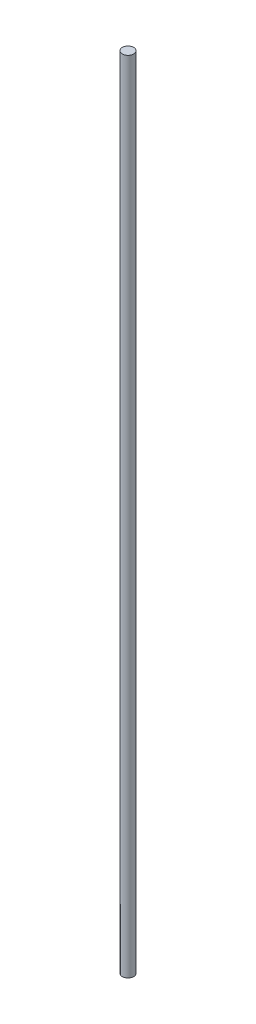
ISO-10303-21;
HEADER;
FILE_DESCRIPTION(('STEP AP214'),'2;1');
FILE_NAME('part.step','',(''),(''),'','','');
FILE_SCHEMA(('AUTOMOTIVE_DESIGN { 1 0 10303 214 1 1 1 1 }'));
ENDSEC;
DATA;
#1=APPLICATION_CONTEXT('core data for automotive mechanical design processes');
#2=APPLICATION_PROTOCOL_DEFINITION('international standard','automotive_design',2000,#1);
#3=PRODUCT_CONTEXT('',#1,'mechanical');
#4=PRODUCT('Part','Part','',(#3));
#5=PRODUCT_RELATED_PRODUCT_CATEGORY('part','',(#4));
#6=PRODUCT_DEFINITION_FORMATION('','',#4);
#7=PRODUCT_DEFINITION_CONTEXT('part definition',#1,'design');
#8=PRODUCT_DEFINITION('design','',#6,#7);
#9=PRODUCT_DEFINITION_SHAPE('','',#8);
#10=(LENGTH_UNIT() NAMED_UNIT(*) SI_UNIT(.MILLI.,.METRE.));
#11=(NAMED_UNIT(*) PLANE_ANGLE_UNIT() SI_UNIT($,.RADIAN.));
#12=(NAMED_UNIT(*) SI_UNIT($,.STERADIAN.) SOLID_ANGLE_UNIT());
#13=UNCERTAINTY_MEASURE_WITH_UNIT(LENGTH_MEASURE(1.E-05),#10,'distance_accuracy_value','');
#14=(GEOMETRIC_REPRESENTATION_CONTEXT(3) GLOBAL_UNCERTAINTY_ASSIGNED_CONTEXT((#13)) GLOBAL_UNIT_ASSIGNED_CONTEXT((#10,
#11,#12)) REPRESENTATION_CONTEXT('',''));
#15=CARTESIAN_POINT('',(0.,0.,0.));
#16=DIRECTION('',(0.,0.,1.));
#17=DIRECTION('',(1.,0.,0.));
#18=AXIS2_PLACEMENT_3D('',#15,#16,#17);
#19=CARTESIAN_POINT('',(0.,350.,0.));
#20=DIRECTION('',(0.,-1.,0.));
#21=DIRECTION('',(0.,0.,-1.));
#22=AXIS2_PLACEMENT_3D('',#19,#20,#21);
#23=CYLINDRICAL_SURFACE('',#22,2.5);
#24=CARTESIAN_POINT('',(0.,350.,0.));
#25=DIRECTION('',(0.,1.,0.));
#26=DIRECTION('',(0.,0.,1.));
#27=AXIS2_PLACEMENT_3D('',#24,#25,#26);
#28=CIRCLE('',#27,2.5);
#29=CARTESIAN_POINT('',(0.,350.,2.5));
#30=VERTEX_POINT('',#29);
#31=EDGE_CURVE('E10',#30,#30,#28,.T.);
#32=ORIENTED_EDGE('',*,*,#31,.F.);
#33=EDGE_LOOP('',(#32));
#34=FACE_BOUND('',#33,.T.);
#35=CARTESIAN_POINT('',(0.,0.,0.));
#36=DIRECTION('',(0.,1.,0.));
#37=DIRECTION('',(0.,0.,1.));
#38=AXIS2_PLACEMENT_3D('',#35,#36,#37);
#39=CIRCLE('',#38,2.5);
#40=CARTESIAN_POINT('',(0.,0.,2.5));
#41=VERTEX_POINT('',#40);
#42=EDGE_CURVE('E36',#41,#41,#39,.T.);
#43=ORIENTED_EDGE('',*,*,#42,.T.);
#44=EDGE_LOOP('',(#43));
#45=FACE_BOUND('',#44,.T.);
#46=ADVANCED_FACE('F33',(#34,#45),#23,.T.);
#47=CARTESIAN_POINT('',(0.,350.,0.));
#48=DIRECTION('',(0.,1.,0.));
#49=DIRECTION('',(0.,0.,1.));
#50=AXIS2_PLACEMENT_3D('',#47,#48,#49);
#51=PLANE('',#50);
#52=ORIENTED_EDGE('',*,*,#31,.T.);
#53=EDGE_LOOP('',(#52));
#54=FACE_BOUND('',#53,.T.);
#55=ADVANCED_FACE('F48',(#54),#51,.T.);
#56=CARTESIAN_POINT('',(0.,0.,0.));
#57=DIRECTION('',(0.,1.,0.));
#58=DIRECTION('',(0.,0.,1.));
#59=AXIS2_PLACEMENT_3D('',#56,#57,#58);
#60=PLANE('',#59);
#61=ORIENTED_EDGE('',*,*,#42,.F.);
#62=EDGE_LOOP('',(#61));
#63=FACE_BOUND('',#62,.T.);
#64=ADVANCED_FACE('F46',(#63),#60,.F.);
#65=CLOSED_SHELL('',(#46,#55,#64));
#66=MANIFOLD_SOLID_BREP('B2',#65);
#67=ADVANCED_BREP_SHAPE_REPRESENTATION('',(#18,#66),#14);
#68=SHAPE_DEFINITION_REPRESENTATION(#9,#67);
ENDSEC;
END-ISO-10303-21;
